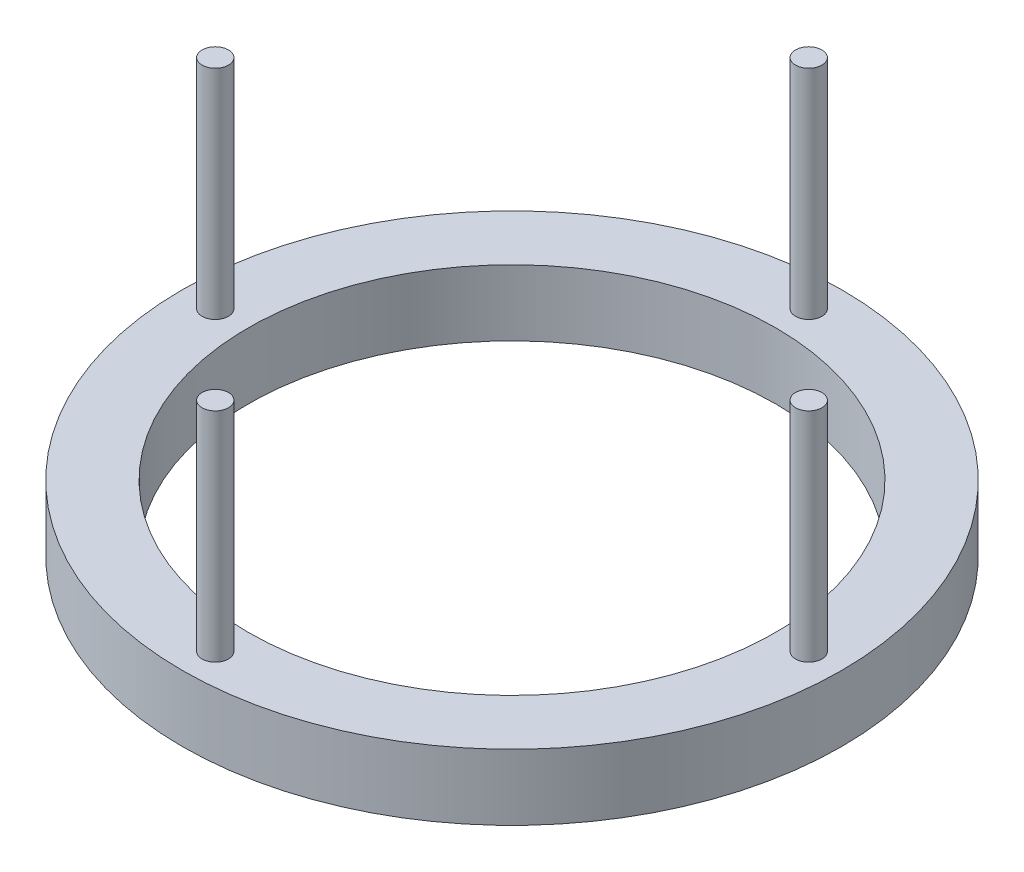
ISO-10303-21;
HEADER;
FILE_DESCRIPTION(('STEP AP214'),'2;1');
FILE_NAME('part.step','',(''),(''),'','','');
FILE_SCHEMA(('AUTOMOTIVE_DESIGN { 1 0 10303 214 1 1 1 1 }'));
ENDSEC;
DATA;
#1=APPLICATION_CONTEXT('core data for automotive mechanical design processes');
#2=APPLICATION_PROTOCOL_DEFINITION('international standard','automotive_design',2000,#1);
#3=PRODUCT_CONTEXT('',#1,'mechanical');
#4=PRODUCT('Part','Part','',(#3));
#5=PRODUCT_RELATED_PRODUCT_CATEGORY('part','',(#4));
#6=PRODUCT_DEFINITION_FORMATION('','',#4);
#7=PRODUCT_DEFINITION_CONTEXT('part definition',#1,'design');
#8=PRODUCT_DEFINITION('design','',#6,#7);
#9=PRODUCT_DEFINITION_SHAPE('','',#8);
#10=(LENGTH_UNIT() NAMED_UNIT(*) SI_UNIT(.MILLI.,.METRE.));
#11=(NAMED_UNIT(*) PLANE_ANGLE_UNIT() SI_UNIT($,.RADIAN.));
#12=(NAMED_UNIT(*) SI_UNIT($,.STERADIAN.) SOLID_ANGLE_UNIT());
#13=UNCERTAINTY_MEASURE_WITH_UNIT(LENGTH_MEASURE(1.E-05),#10,'distance_accuracy_value','');
#14=(GEOMETRIC_REPRESENTATION_CONTEXT(3) GLOBAL_UNCERTAINTY_ASSIGNED_CONTEXT((#13)) GLOBAL_UNIT_ASSIGNED_CONTEXT((#10,
#11,#12)) REPRESENTATION_CONTEXT('',''));
#15=CARTESIAN_POINT('',(0.,0.,0.));
#16=DIRECTION('',(0.,0.,1.));
#17=DIRECTION('',(1.,0.,0.));
#18=AXIS2_PLACEMENT_3D('',#15,#16,#17);
#19=CARTESIAN_POINT('',(0.,10.,0.));
#20=DIRECTION('',(0.,1.,0.));
#21=DIRECTION('',(0.,0.,1.));
#22=AXIS2_PLACEMENT_3D('',#19,#20,#21);
#23=PLANE('',#22);
#24=CARTESIAN_POINT('',(45.,10.,-4.72362668651943E-13));
#25=DIRECTION('',(0.,1.,0.));
#26=DIRECTION('',(-1.,0.,0.));
#27=AXIS2_PLACEMENT_3D('',#24,#25,#26);
#28=CIRCLE('',#27,2.);
#29=CARTESIAN_POINT('',(43.,10.,-4.51413780618884E-13));
#30=VERTEX_POINT('',#29);
#31=EDGE_CURVE('E72',#30,#30,#28,.T.);
#32=ORIENTED_EDGE('',*,*,#31,.F.);
#33=EDGE_LOOP('',(#32));
#34=FACE_BOUND('',#33,.T.);
#35=CARTESIAN_POINT('',(0.,10.,45.));
#36=DIRECTION('',(0.,1.,0.));
#37=DIRECTION('',(0.,0.,-1.));
#38=AXIS2_PLACEMENT_3D('',#35,#36,#37);
#39=CIRCLE('',#38,2.);
#40=CARTESIAN_POINT('',(0.,10.,43.));
#41=VERTEX_POINT('',#40);
#42=EDGE_CURVE('E66',#41,#41,#39,.T.);
#43=ORIENTED_EDGE('',*,*,#42,.F.);
#44=EDGE_LOOP('',(#43));
#45=FACE_BOUND('',#44,.T.);
#46=CARTESIAN_POINT('',(-45.,10.,1.58129348156061E-13));
#47=DIRECTION('',(0.,1.,0.));
#48=DIRECTION('',(1.,0.,0.));
#49=AXIS2_PLACEMENT_3D('',#46,#47,#48);
#50=CIRCLE('',#49,2.);
#51=CARTESIAN_POINT('',(-43.,10.,1.51146385478375E-13));
#52=VERTEX_POINT('',#51);
#53=EDGE_CURVE('E60',#52,#52,#50,.T.);
#54=ORIENTED_EDGE('',*,*,#53,.F.);
#55=EDGE_LOOP('',(#54));
#56=FACE_BOUND('',#55,.T.);
#57=CARTESIAN_POINT('',(0.,10.,-45.));
#58=DIRECTION('',(0.,1.,0.));
#59=DIRECTION('',(0.,0.,1.));
#60=AXIS2_PLACEMENT_3D('',#57,#58,#59);
#61=CIRCLE('',#60,2.);
#62=CARTESIAN_POINT('',(0.,10.,-43.));
#63=VERTEX_POINT('',#62);
#64=EDGE_CURVE('E54',#63,#63,#61,.T.);
#65=ORIENTED_EDGE('',*,*,#64,.F.);
#66=EDGE_LOOP('',(#65));
#67=FACE_BOUND('',#66,.T.);
#68=CARTESIAN_POINT('',(0.,10.,0.));
#69=DIRECTION('',(0.,1.,0.));
#70=DIRECTION('',(0.,0.,1.));
#71=AXIS2_PLACEMENT_3D('',#68,#69,#70);
#72=CIRCLE('',#71,50.);
#73=CARTESIAN_POINT('',(0.,10.,50.));
#74=VERTEX_POINT('',#73);
#75=EDGE_CURVE('E10',#74,#74,#72,.T.);
#76=ORIENTED_EDGE('',*,*,#75,.T.);
#77=EDGE_LOOP('',(#76));
#78=FACE_BOUND('',#77,.T.);
#79=CARTESIAN_POINT('',(0.,10.,0.));
#80=DIRECTION('',(0.,1.,0.));
#81=DIRECTION('',(0.,0.,1.));
#82=AXIS2_PLACEMENT_3D('',#79,#80,#81);
#83=CIRCLE('',#82,40.);
#84=CARTESIAN_POINT('',(0.,10.,40.));
#85=VERTEX_POINT('',#84);
#86=EDGE_CURVE('E46',#85,#85,#83,.T.);
#87=ORIENTED_EDGE('',*,*,#86,.F.);
#88=EDGE_LOOP('',(#87));
#89=FACE_BOUND('',#88,.T.);
#90=ADVANCED_FACE('F35',(#34,#45,#56,#67,#78,#89),#23,.T.);
#91=CARTESIAN_POINT('',(0.,0.,0.));
#92=DIRECTION('',(0.,1.,0.));
#93=DIRECTION('',(0.,0.,1.));
#94=AXIS2_PLACEMENT_3D('',#91,#92,#93);
#95=PLANE('',#94);
#96=CARTESIAN_POINT('',(0.,0.,0.));
#97=DIRECTION('',(0.,1.,0.));
#98=DIRECTION('',(0.,0.,1.));
#99=AXIS2_PLACEMENT_3D('',#96,#97,#98);
#100=CIRCLE('',#99,50.);
#101=CARTESIAN_POINT('',(0.,0.,50.));
#102=VERTEX_POINT('',#101);
#103=EDGE_CURVE('E39',#102,#102,#100,.T.);
#104=ORIENTED_EDGE('',*,*,#103,.F.);
#105=EDGE_LOOP('',(#104));
#106=FACE_BOUND('',#105,.T.);
#107=CARTESIAN_POINT('',(0.,0.,0.));
#108=DIRECTION('',(0.,1.,0.));
#109=DIRECTION('',(0.,0.,1.));
#110=AXIS2_PLACEMENT_3D('',#107,#108,#109);
#111=CIRCLE('',#110,40.);
#112=CARTESIAN_POINT('',(0.,0.,40.));
#113=VERTEX_POINT('',#112);
#114=EDGE_CURVE('E48',#113,#113,#111,.T.);
#115=ORIENTED_EDGE('',*,*,#114,.T.);
#116=EDGE_LOOP('',(#115));
#117=FACE_BOUND('',#116,.T.);
#118=ADVANCED_FACE('F89',(#106,#117),#95,.F.);
#119=CARTESIAN_POINT('',(0.,10.,0.));
#120=DIRECTION('',(0.,-1.,0.));
#121=DIRECTION('',(0.,0.,-1.));
#122=AXIS2_PLACEMENT_3D('',#119,#120,#121);
#123=CYLINDRICAL_SURFACE('',#122,50.);
#124=ORIENTED_EDGE('',*,*,#75,.F.);
#125=EDGE_LOOP('',(#124));
#126=FACE_BOUND('',#125,.T.);
#127=ORIENTED_EDGE('',*,*,#103,.T.);
#128=EDGE_LOOP('',(#127));
#129=FACE_BOUND('',#128,.T.);
#130=ADVANCED_FACE('F37',(#126,#129),#123,.T.);
#131=CARTESIAN_POINT('',(0.,10.,0.));
#132=DIRECTION('',(0.,-1.,0.));
#133=DIRECTION('',(0.,0.,-1.));
#134=AXIS2_PLACEMENT_3D('',#131,#132,#133);
#135=CYLINDRICAL_SURFACE('',#134,40.);
#136=ORIENTED_EDGE('',*,*,#86,.T.);
#137=EDGE_LOOP('',(#136));
#138=FACE_BOUND('',#137,.T.);
#139=ORIENTED_EDGE('',*,*,#114,.F.);
#140=EDGE_LOOP('',(#139));
#141=FACE_BOUND('',#140,.T.);
#142=ADVANCED_FACE('F99',(#138,#141),#135,.F.);
#143=CARTESIAN_POINT('',(0.,43.,-45.));
#144=DIRECTION('',(0.,-1.,0.));
#145=DIRECTION('',(0.,0.,-1.));
#146=AXIS2_PLACEMENT_3D('',#143,#144,#145);
#147=CYLINDRICAL_SURFACE('',#146,2.);
#148=CARTESIAN_POINT('',(0.,43.,-45.));
#149=DIRECTION('',(0.,1.,0.));
#150=DIRECTION('',(0.,0.,1.));
#151=AXIS2_PLACEMENT_3D('',#148,#149,#150);
#152=CIRCLE('',#151,2.);
#153=CARTESIAN_POINT('',(0.,43.,-43.));
#154=VERTEX_POINT('',#153);
#155=EDGE_CURVE('E51',#154,#154,#152,.T.);
#156=ORIENTED_EDGE('',*,*,#155,.F.);
#157=EDGE_LOOP('',(#156));
#158=FACE_BOUND('',#157,.T.);
#159=ORIENTED_EDGE('',*,*,#64,.T.);
#160=EDGE_LOOP('',(#159));
#161=FACE_BOUND('',#160,.T.);
#162=ADVANCED_FACE('F102',(#158,#161),#147,.T.);
#163=CARTESIAN_POINT('',(0.,43.,-45.));
#164=DIRECTION('',(0.,1.,0.));
#165=DIRECTION('',(0.,0.,1.));
#166=AXIS2_PLACEMENT_3D('',#163,#164,#165);
#167=PLANE('',#166);
#168=ORIENTED_EDGE('',*,*,#155,.T.);
#169=EDGE_LOOP('',(#168));
#170=FACE_BOUND('',#169,.T.);
#171=ADVANCED_FACE('F116',(#170),#167,.T.);
#172=CARTESIAN_POINT('',(-45.,43.,1.58129348156061E-13));
#173=DIRECTION('',(0.,-1.,0.));
#174=DIRECTION('',(0.,0.,-1.));
#175=AXIS2_PLACEMENT_3D('',#172,#173,#174);
#176=CYLINDRICAL_SURFACE('',#175,2.);
#177=CARTESIAN_POINT('',(-45.,43.,1.58129348156061E-13));
#178=DIRECTION('',(0.,1.,0.));
#179=DIRECTION('',(1.,0.,0.));
#180=AXIS2_PLACEMENT_3D('',#177,#178,#179);
#181=CIRCLE('',#180,2.);
#182=CARTESIAN_POINT('',(-43.,43.,1.51146385478375E-13));
#183=VERTEX_POINT('',#182);
#184=EDGE_CURVE('E57',#183,#183,#181,.T.);
#185=ORIENTED_EDGE('',*,*,#184,.F.);
#186=EDGE_LOOP('',(#185));
#187=FACE_BOUND('',#186,.T.);
#188=ORIENTED_EDGE('',*,*,#53,.T.);
#189=EDGE_LOOP('',(#188));
#190=FACE_BOUND('',#189,.T.);
#191=ADVANCED_FACE('F120',(#187,#190),#176,.T.);
#192=CARTESIAN_POINT('',(-45.,43.,1.58129348156061E-13));
#193=DIRECTION('',(0.,1.,0.));
#194=DIRECTION('',(1.,0.,0.));
#195=AXIS2_PLACEMENT_3D('',#192,#193,#194);
#196=PLANE('',#195);
#197=ORIENTED_EDGE('',*,*,#184,.T.);
#198=EDGE_LOOP('',(#197));
#199=FACE_BOUND('',#198,.T.);
#200=ADVANCED_FACE('F124',(#199),#196,.T.);
#201=CARTESIAN_POINT('',(0.,43.,45.));
#202=DIRECTION('',(0.,-1.,0.));
#203=DIRECTION('',(0.,0.,-1.));
#204=AXIS2_PLACEMENT_3D('',#201,#202,#203);
#205=CYLINDRICAL_SURFACE('',#204,2.);
#206=CARTESIAN_POINT('',(0.,43.,45.));
#207=DIRECTION('',(0.,1.,0.));
#208=DIRECTION('',(0.,0.,-1.));
#209=AXIS2_PLACEMENT_3D('',#206,#207,#208);
#210=CIRCLE('',#209,2.);
#211=CARTESIAN_POINT('',(0.,43.,43.));
#212=VERTEX_POINT('',#211);
#213=EDGE_CURVE('E63',#212,#212,#210,.T.);
#214=ORIENTED_EDGE('',*,*,#213,.F.);
#215=EDGE_LOOP('',(#214));
#216=FACE_BOUND('',#215,.T.);
#217=ORIENTED_EDGE('',*,*,#42,.T.);
#218=EDGE_LOOP('',(#217));
#219=FACE_BOUND('',#218,.T.);
#220=ADVANCED_FACE('F128',(#216,#219),#205,.T.);
#221=CARTESIAN_POINT('',(0.,43.,45.));
#222=DIRECTION('',(0.,1.,0.));
#223=DIRECTION('',(0.,0.,-1.));
#224=AXIS2_PLACEMENT_3D('',#221,#222,#223);
#225=PLANE('',#224);
#226=ORIENTED_EDGE('',*,*,#213,.T.);
#227=EDGE_LOOP('',(#226));
#228=FACE_BOUND('',#227,.T.);
#229=ADVANCED_FACE('F83',(#228),#225,.T.);
#230=CARTESIAN_POINT('',(45.,43.,-4.72362668651943E-13));
#231=DIRECTION('',(0.,-1.,0.));
#232=DIRECTION('',(0.,0.,-1.));
#233=AXIS2_PLACEMENT_3D('',#230,#231,#232);
#234=CYLINDRICAL_SURFACE('',#233,2.);
#235=CARTESIAN_POINT('',(45.,43.,-4.72362668651943E-13));
#236=DIRECTION('',(0.,1.,0.));
#237=DIRECTION('',(-1.,0.,0.));
#238=AXIS2_PLACEMENT_3D('',#235,#236,#237);
#239=CIRCLE('',#238,2.);
#240=CARTESIAN_POINT('',(43.,43.,-4.51413780618884E-13));
#241=VERTEX_POINT('',#240);
#242=EDGE_CURVE('E69',#241,#241,#239,.T.);
#243=ORIENTED_EDGE('',*,*,#242,.F.);
#244=EDGE_LOOP('',(#243));
#245=FACE_BOUND('',#244,.T.);
#246=ORIENTED_EDGE('',*,*,#31,.T.);
#247=EDGE_LOOP('',(#246));
#248=FACE_BOUND('',#247,.T.);
#249=ADVANCED_FACE('F80',(#245,#248),#234,.T.);
#250=CARTESIAN_POINT('',(45.,43.,-4.72362668651943E-13));
#251=DIRECTION('',(0.,1.,0.));
#252=DIRECTION('',(-1.,0.,0.));
#253=AXIS2_PLACEMENT_3D('',#250,#251,#252);
#254=PLANE('',#253);
#255=ORIENTED_EDGE('',*,*,#242,.T.);
#256=EDGE_LOOP('',(#255));
#257=FACE_BOUND('',#256,.T.);
#258=ADVANCED_FACE('F78',(#257),#254,.T.);
#259=CLOSED_SHELL('',(#90,#118,#130,#142,#162,#171,#191,#200,#220,#229,#249,#258));
#260=MANIFOLD_SOLID_BREP('B2',#259);
#261=ADVANCED_BREP_SHAPE_REPRESENTATION('',(#18,#260),#14);
#262=SHAPE_DEFINITION_REPRESENTATION(#9,#261);
ENDSEC;
END-ISO-10303-21;
